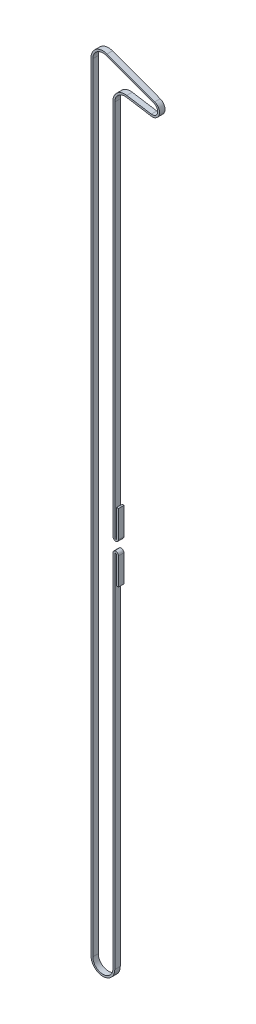
ISO-10303-21;
HEADER;
FILE_DESCRIPTION(('STEP AP214'),'2;1');
FILE_NAME('part.step','',(''),(''),'','','');
FILE_SCHEMA(('AUTOMOTIVE_DESIGN { 1 0 10303 214 1 1 1 1 }'));
ENDSEC;
DATA;
#1=APPLICATION_CONTEXT('core data for automotive mechanical design processes');
#2=APPLICATION_PROTOCOL_DEFINITION('international standard','automotive_design',2000,#1);
#3=PRODUCT_CONTEXT('',#1,'mechanical');
#4=PRODUCT('Part','Part','',(#3));
#5=PRODUCT_RELATED_PRODUCT_CATEGORY('part','',(#4));
#6=PRODUCT_DEFINITION_FORMATION('','',#4);
#7=PRODUCT_DEFINITION_CONTEXT('part definition',#1,'design');
#8=PRODUCT_DEFINITION('design','',#6,#7);
#9=PRODUCT_DEFINITION_SHAPE('','',#8);
#10=(LENGTH_UNIT() NAMED_UNIT(*) SI_UNIT(.MILLI.,.METRE.));
#11=(NAMED_UNIT(*) PLANE_ANGLE_UNIT() SI_UNIT($,.RADIAN.));
#12=(NAMED_UNIT(*) SI_UNIT($,.STERADIAN.) SOLID_ANGLE_UNIT());
#13=UNCERTAINTY_MEASURE_WITH_UNIT(LENGTH_MEASURE(1.E-05),#10,'distance_accuracy_value','');
#14=(GEOMETRIC_REPRESENTATION_CONTEXT(3) GLOBAL_UNCERTAINTY_ASSIGNED_CONTEXT((#13)) GLOBAL_UNIT_ASSIGNED_CONTEXT((#10,
#11,#12)) REPRESENTATION_CONTEXT('',''));
#15=CARTESIAN_POINT('',(0.,0.,0.));
#16=DIRECTION('',(0.,0.,1.));
#17=DIRECTION('',(1.,0.,0.));
#18=AXIS2_PLACEMENT_3D('',#15,#16,#17);
#19=CARTESIAN_POINT('',(12.9999999999839,-733.966690530104,6.));
#20=DIRECTION('',(0.,0.,-1.));
#21=DIRECTION('',(-1.,0.,0.));
#22=AXIS2_PLACEMENT_3D('',#19,#20,#21);
#23=CYLINDRICAL_SURFACE('',#22,12.9999999999839);
#24=CARTESIAN_POINT('',(12.9999999999839,-733.966690530104,0.));
#25=DIRECTION('',(0.,0.,1.));
#26=DIRECTION('',(1.,0.,0.));
#27=AXIS2_PLACEMENT_3D('',#24,#25,#26);
#28=CIRCLE('',#27,12.9999999999839);
#29=CARTESIAN_POINT('',(0.,-733.9666905301,0.));
#30=VERTEX_POINT('',#29);
#31=CARTESIAN_POINT('',(25.9999999999678,-733.966690530096,0.));
#32=VERTEX_POINT('',#31);
#33=EDGE_CURVE('E254',#30,#32,#28,.T.);
#34=ORIENTED_EDGE('',*,*,#33,.T.);
#35=DIRECTION('',(0.,0.,-1.));
#36=VECTOR('',#35,1.);
#37=CARTESIAN_POINT('',(25.9999999999678,-733.966690530096,6.));
#38=LINE('',#37,#36);
#39=CARTESIAN_POINT('',(25.9999999999678,-733.966690530096,6.));
#40=VERTEX_POINT('',#39);
#41=EDGE_CURVE('E41',#40,#32,#38,.T.);
#42=ORIENTED_EDGE('',*,*,#41,.F.);
#43=CARTESIAN_POINT('',(12.9999999999839,-733.966690530104,6.));
#44=DIRECTION('',(0.,0.,1.));
#45=DIRECTION('',(1.,0.,0.));
#46=AXIS2_PLACEMENT_3D('',#43,#44,#45);
#47=CIRCLE('',#46,12.9999999999839);
#48=CARTESIAN_POINT('',(0.,-733.9666905301,6.));
#49=VERTEX_POINT('',#48);
#50=EDGE_CURVE('E154',#49,#40,#47,.T.);
#51=ORIENTED_EDGE('',*,*,#50,.F.);
#52=DIRECTION('',(0.,0.,-1.));
#53=VECTOR('',#52,1.);
#54=CARTESIAN_POINT('',(0.,-733.9666905301,6.));
#55=LINE('',#54,#53);
#56=EDGE_CURVE('E11',#49,#30,#55,.T.);
#57=ORIENTED_EDGE('',*,*,#56,.T.);
#58=EDGE_LOOP('',(#34,#42,#51,#57));
#59=FACE_BOUND('',#58,.T.);
#60=ADVANCED_FACE('F33',(#59),#23,.T.);
#61=CARTESIAN_POINT('',(25.9999999999678,-340.488878188657,6.));
#62=DIRECTION('',(-1.,0.,0.));
#63=DIRECTION('',(0.,0.,1.));
#64=AXIS2_PLACEMENT_3D('',#61,#62,#63);
#65=PLANE('',#64);
#66=DIRECTION('',(0.,1.,0.));
#67=VECTOR('',#66,1.);
#68=CARTESIAN_POINT('',(25.9999999999678,-340.488878188657,0.));
#69=LINE('',#68,#67);
#70=CARTESIAN_POINT('',(25.9999999999678,-340.488878188657,0.));
#71=VERTEX_POINT('',#70);
#72=EDGE_CURVE('E256',#32,#71,#69,.T.);
#73=ORIENTED_EDGE('',*,*,#72,.T.);
#74=DIRECTION('',(0.,0.,-1.));
#75=VECTOR('',#74,1.);
#76=CARTESIAN_POINT('',(25.9999999999678,-340.488878188657,6.));
#77=LINE('',#76,#75);
#78=CARTESIAN_POINT('',(25.9999999999678,-340.488878188657,6.));
#79=VERTEX_POINT('',#78);
#80=EDGE_CURVE('E374',#79,#71,#77,.T.);
#81=ORIENTED_EDGE('',*,*,#80,.F.);
#82=DIRECTION('',(0.,1.,0.));
#83=VECTOR('',#82,1.);
#84=CARTESIAN_POINT('',(25.9999999999678,-340.488878188657,6.));
#85=LINE('',#84,#83);
#86=EDGE_CURVE('E382',#40,#79,#85,.T.);
#87=ORIENTED_EDGE('',*,*,#86,.F.);
#88=ORIENTED_EDGE('',*,*,#41,.T.);
#89=EDGE_LOOP('',(#73,#81,#87,#88));
#90=FACE_BOUND('',#89,.T.);
#91=ADVANCED_FACE('F380',(#90),#65,.F.);
#92=CARTESIAN_POINT('',(26.9999996990473,-340.488878188657,6.));
#93=DIRECTION('',(0.,0.,-1.));
#94=DIRECTION('',(-1.,0.,0.));
#95=AXIS2_PLACEMENT_3D('',#92,#93,#94);
#96=CYLINDRICAL_SURFACE('',#95,0.999999699079478);
#97=CARTESIAN_POINT('',(26.9999996990473,-340.488878188657,0.));
#98=DIRECTION('',(0.,0.,-1.));
#99=DIRECTION('',(-1.,0.,0.));
#100=AXIS2_PLACEMENT_3D('',#97,#98,#99);
#101=CIRCLE('',#100,0.999999699079478);
#102=CARTESIAN_POINT('',(27.9999993981268,-340.488878188657,0.));
#103=VERTEX_POINT('',#102);
#104=EDGE_CURVE('E258',#71,#103,#101,.T.);
#105=ORIENTED_EDGE('',*,*,#104,.T.);
#106=DIRECTION('',(0.,0.,-1.));
#107=VECTOR('',#106,1.);
#108=CARTESIAN_POINT('',(27.9999993981268,-340.488878188657,6.));
#109=LINE('',#108,#107);
#110=CARTESIAN_POINT('',(27.9999993981268,-340.488878188657,6.));
#111=VERTEX_POINT('',#110);
#112=EDGE_CURVE('E371',#111,#103,#109,.T.);
#113=ORIENTED_EDGE('',*,*,#112,.F.);
#114=CARTESIAN_POINT('',(26.9999996990473,-340.488878188657,6.));
#115=DIRECTION('',(0.,0.,-1.));
#116=DIRECTION('',(-1.,0.,0.));
#117=AXIS2_PLACEMENT_3D('',#114,#115,#116);
#118=CIRCLE('',#117,0.999999699079478);
#119=EDGE_CURVE('E398',#79,#111,#118,.T.);
#120=ORIENTED_EDGE('',*,*,#119,.F.);
#121=ORIENTED_EDGE('',*,*,#80,.T.);
#122=EDGE_LOOP('',(#105,#113,#120,#121));
#123=FACE_BOUND('',#122,.T.);
#124=ADVANCED_FACE('F389',(#123),#96,.F.);
#125=CARTESIAN_POINT('',(27.9999993981268,-340.488878188657,6.));
#126=DIRECTION('',(1.,0.,0.));
#127=DIRECTION('',(0.,0.,-1.));
#128=AXIS2_PLACEMENT_3D('',#125,#126,#127);
#129=PLANE('',#128);
#130=DIRECTION('',(0.,-1.,0.));
#131=VECTOR('',#130,1.);
#132=CARTESIAN_POINT('',(27.9999993981268,-340.488878188657,0.));
#133=LINE('',#132,#131);
#134=CARTESIAN_POINT('',(27.9999993981268,-370.001272476446,0.));
#135=VERTEX_POINT('',#134);
#136=EDGE_CURVE('E260',#103,#135,#133,.T.);
#137=ORIENTED_EDGE('',*,*,#136,.T.);
#138=DIRECTION('',(0.,0.,-1.));
#139=VECTOR('',#138,1.);
#140=CARTESIAN_POINT('',(27.9999993981268,-370.001272476446,6.));
#141=LINE('',#140,#139);
#142=CARTESIAN_POINT('',(27.9999993981268,-370.001272476446,6.));
#143=VERTEX_POINT('',#142);
#144=EDGE_CURVE('E368',#143,#135,#141,.T.);
#145=ORIENTED_EDGE('',*,*,#144,.F.);
#146=DIRECTION('',(0.,-1.,0.));
#147=VECTOR('',#146,1.);
#148=CARTESIAN_POINT('',(27.9999993981268,-340.488878188657,6.));
#149=LINE('',#148,#147);
#150=EDGE_CURVE('E395',#111,#143,#149,.T.);
#151=ORIENTED_EDGE('',*,*,#150,.F.);
#152=ORIENTED_EDGE('',*,*,#112,.T.);
#153=EDGE_LOOP('',(#137,#145,#151,#152));
#154=FACE_BOUND('',#153,.T.);
#155=ADVANCED_FACE('F393',(#154),#129,.F.);
#156=CARTESIAN_POINT('',(27.9999993981268,-370.001272476446,6.));
#157=DIRECTION('',(0.,1.,0.));
#158=DIRECTION('',(0.,0.,1.));
#159=AXIS2_PLACEMENT_3D('',#156,#157,#158);
#160=PLANE('',#159);
#161=DIRECTION('',(1.,0.,0.));
#162=VECTOR('',#161,1.);
#163=CARTESIAN_POINT('',(27.9999993981268,-370.001272476446,0.));
#164=LINE('',#163,#162);
#165=CARTESIAN_POINT('',(29.9999993998322,-370.001272476446,0.));
#166=VERTEX_POINT('',#165);
#167=EDGE_CURVE('E262',#135,#166,#164,.T.);
#168=ORIENTED_EDGE('',*,*,#167,.T.);
#169=DIRECTION('',(0.,0.,-1.));
#170=VECTOR('',#169,1.);
#171=CARTESIAN_POINT('',(29.9999993998322,-370.001272476446,6.));
#172=LINE('',#171,#170);
#173=CARTESIAN_POINT('',(29.9999993998322,-370.001272476446,6.));
#174=VERTEX_POINT('',#173);
#175=EDGE_CURVE('E365',#174,#166,#172,.T.);
#176=ORIENTED_EDGE('',*,*,#175,.F.);
#177=DIRECTION('',(1.,0.,0.));
#178=VECTOR('',#177,1.);
#179=CARTESIAN_POINT('',(27.9999993981268,-370.001272476446,6.));
#180=LINE('',#179,#178);
#181=EDGE_CURVE('E397',#143,#174,#180,.T.);
#182=ORIENTED_EDGE('',*,*,#181,.F.);
#183=ORIENTED_EDGE('',*,*,#144,.T.);
#184=EDGE_LOOP('',(#168,#176,#182,#183));
#185=FACE_BOUND('',#184,.T.);
#186=ADVANCED_FACE('F464',(#185),#160,.F.);
#187=CARTESIAN_POINT('',(29.9999993998322,-370.001272476446,6.));
#188=DIRECTION('',(-1.,0.,0.));
#189=DIRECTION('',(0.,0.,1.));
#190=AXIS2_PLACEMENT_3D('',#187,#188,#189);
#191=PLANE('',#190);
#192=DIRECTION('',(0.,1.,0.));
#193=VECTOR('',#192,1.);
#194=CARTESIAN_POINT('',(29.9999993998322,-370.001272476446,0.));
#195=LINE('',#194,#193);
#196=CARTESIAN_POINT('',(29.9999993998322,-340.488878188651,0.));
#197=VERTEX_POINT('',#196);
#198=EDGE_CURVE('E264',#166,#197,#195,.T.);
#199=ORIENTED_EDGE('',*,*,#198,.T.);
#200=DIRECTION('',(0.,0.,-1.));
#201=VECTOR('',#200,1.);
#202=CARTESIAN_POINT('',(29.9999993998322,-340.488878188651,6.));
#203=LINE('',#202,#201);
#204=CARTESIAN_POINT('',(29.9999993998322,-340.488878188651,6.));
#205=VERTEX_POINT('',#204);
#206=EDGE_CURVE('E362',#205,#197,#203,.T.);
#207=ORIENTED_EDGE('',*,*,#206,.F.);
#208=DIRECTION('',(0.,1.,0.));
#209=VECTOR('',#208,1.);
#210=CARTESIAN_POINT('',(29.9999993998322,-370.001272476446,6.));
#211=LINE('',#210,#209);
#212=EDGE_CURVE('E400',#174,#205,#211,.T.);
#213=ORIENTED_EDGE('',*,*,#212,.F.);
#214=ORIENTED_EDGE('',*,*,#175,.T.);
#215=EDGE_LOOP('',(#199,#207,#213,#214));
#216=FACE_BOUND('',#215,.T.);
#217=ADVANCED_FACE('F467',(#216),#191,.F.);
#218=CARTESIAN_POINT('',(26.9999996999,-340.488878188651,6.));
#219=DIRECTION('',(0.,0.,-1.));
#220=DIRECTION('',(-1.,0.,0.));
#221=AXIS2_PLACEMENT_3D('',#218,#219,#220);
#222=CYLINDRICAL_SURFACE('',#221,2.99999969993219);
#223=CARTESIAN_POINT('',(26.9999996999,-340.488878188651,0.));
#224=DIRECTION('',(0.,0.,1.));
#225=DIRECTION('',(-1.,0.,0.));
#226=AXIS2_PLACEMENT_3D('',#223,#224,#225);
#227=CIRCLE('',#226,2.99999969993219);
#228=CARTESIAN_POINT('',(23.9999999999678,-340.488878188651,0.));
#229=VERTEX_POINT('',#228);
#230=EDGE_CURVE('E266',#197,#229,#227,.T.);
#231=ORIENTED_EDGE('',*,*,#230,.T.);
#232=DIRECTION('',(0.,0.,-1.));
#233=VECTOR('',#232,1.);
#234=CARTESIAN_POINT('',(23.9999999999678,-340.488878188651,6.));
#235=LINE('',#234,#233);
#236=CARTESIAN_POINT('',(23.9999999999678,-340.488878188651,6.));
#237=VERTEX_POINT('',#236);
#238=EDGE_CURVE('E359',#237,#229,#235,.T.);
#239=ORIENTED_EDGE('',*,*,#238,.F.);
#240=CARTESIAN_POINT('',(26.9999996999,-340.488878188651,6.));
#241=DIRECTION('',(0.,0.,1.));
#242=DIRECTION('',(-1.,0.,0.));
#243=AXIS2_PLACEMENT_3D('',#240,#241,#242);
#244=CIRCLE('',#243,2.99999969993219);
#245=EDGE_CURVE('E406',#205,#237,#244,.T.);
#246=ORIENTED_EDGE('',*,*,#245,.F.);
#247=ORIENTED_EDGE('',*,*,#206,.T.);
#248=EDGE_LOOP('',(#231,#239,#246,#247));
#249=FACE_BOUND('',#248,.T.);
#250=ADVANCED_FACE('F471',(#249),#222,.T.);
#251=CARTESIAN_POINT('',(23.9999999999678,-340.488878188651,6.));
#252=DIRECTION('',(1.,0.,0.));
#253=DIRECTION('',(0.,0.,-1.));
#254=AXIS2_PLACEMENT_3D('',#251,#252,#253);
#255=PLANE('',#254);
#256=DIRECTION('',(0.,-1.,0.));
#257=VECTOR('',#256,1.);
#258=CARTESIAN_POINT('',(23.9999999999678,-340.488878188651,0.));
#259=LINE('',#258,#257);
#260=CARTESIAN_POINT('',(23.9999999999678,-733.966690530104,0.));
#261=VERTEX_POINT('',#260);
#262=EDGE_CURVE('E268',#229,#261,#259,.T.);
#263=ORIENTED_EDGE('',*,*,#262,.T.);
#264=DIRECTION('',(0.,0.,-1.));
#265=VECTOR('',#264,1.);
#266=CARTESIAN_POINT('',(23.9999999999678,-733.966690530104,6.));
#267=LINE('',#266,#265);
#268=CARTESIAN_POINT('',(23.9999999999678,-733.966690530104,6.));
#269=VERTEX_POINT('',#268);
#270=EDGE_CURVE('E356',#269,#261,#267,.T.);
#271=ORIENTED_EDGE('',*,*,#270,.F.);
#272=DIRECTION('',(0.,-1.,0.));
#273=VECTOR('',#272,1.);
#274=CARTESIAN_POINT('',(23.9999999999678,-340.488878188651,6.));
#275=LINE('',#274,#273);
#276=EDGE_CURVE('E408',#237,#269,#275,.T.);
#277=ORIENTED_EDGE('',*,*,#276,.F.);
#278=ORIENTED_EDGE('',*,*,#238,.T.);
#279=EDGE_LOOP('',(#263,#271,#277,#278));
#280=FACE_BOUND('',#279,.T.);
#281=ADVANCED_FACE('F475',(#280),#255,.F.);
#282=CARTESIAN_POINT('',(12.9999999999839,-733.966690530104,6.));
#283=DIRECTION('',(0.,0.,-1.));
#284=DIRECTION('',(-1.,0.,0.));
#285=AXIS2_PLACEMENT_3D('',#282,#283,#284);
#286=CYLINDRICAL_SURFACE('',#285,10.9999999999839);
#287=CARTESIAN_POINT('',(12.9999999999839,-733.966690530104,0.));
#288=DIRECTION('',(0.,0.,-1.));
#289=DIRECTION('',(1.,0.,0.));
#290=AXIS2_PLACEMENT_3D('',#287,#288,#289);
#291=CIRCLE('',#290,10.9999999999839);
#292=CARTESIAN_POINT('',(2.,-733.966690530108,0.));
#293=VERTEX_POINT('',#292);
#294=EDGE_CURVE('E270',#261,#293,#291,.T.);
#295=ORIENTED_EDGE('',*,*,#294,.T.);
#296=DIRECTION('',(0.,0.,-1.));
#297=VECTOR('',#296,1.);
#298=CARTESIAN_POINT('',(2.,-733.966690530108,6.));
#299=LINE('',#298,#297);
#300=CARTESIAN_POINT('',(2.,-733.966690530108,6.));
#301=VERTEX_POINT('',#300);
#302=EDGE_CURVE('E353',#301,#293,#299,.T.);
#303=ORIENTED_EDGE('',*,*,#302,.F.);
#304=CARTESIAN_POINT('',(12.9999999999839,-733.966690530104,6.));
#305=DIRECTION('',(0.,0.,-1.));
#306=DIRECTION('',(1.,0.,0.));
#307=AXIS2_PLACEMENT_3D('',#304,#305,#306);
#308=CIRCLE('',#307,10.9999999999839);
#309=EDGE_CURVE('E410',#269,#301,#308,.T.);
#310=ORIENTED_EDGE('',*,*,#309,.F.);
#311=ORIENTED_EDGE('',*,*,#270,.T.);
#312=EDGE_LOOP('',(#295,#303,#310,#311));
#313=FACE_BOUND('',#312,.T.);
#314=ADVANCED_FACE('F479',(#313),#286,.F.);
#315=CARTESIAN_POINT('',(2.,100.,6.));
#316=DIRECTION('',(-1.,0.,0.));
#317=DIRECTION('',(0.,0.,1.));
#318=AXIS2_PLACEMENT_3D('',#315,#316,#317);
#319=PLANE('',#318);
#320=DIRECTION('',(0.,1.,0.));
#321=VECTOR('',#320,1.);
#322=CARTESIAN_POINT('',(2.,100.,0.));
#323=LINE('',#322,#321);
#324=CARTESIAN_POINT('',(2.,116.09935662604,0.));
#325=VERTEX_POINT('',#324);
#326=EDGE_CURVE('E273',#293,#325,#323,.T.);
#327=ORIENTED_EDGE('',*,*,#326,.T.);
#328=DIRECTION('',(0.,0.,-1.));
#329=VECTOR('',#328,1.);
#330=CARTESIAN_POINT('',(2.,116.09935662604,6.));
#331=LINE('',#330,#329);
#332=CARTESIAN_POINT('',(2.,116.09935662604,6.));
#333=VERTEX_POINT('',#332);
#334=EDGE_CURVE('E350',#333,#325,#331,.T.);
#335=ORIENTED_EDGE('',*,*,#334,.F.);
#336=DIRECTION('',(0.,1.,0.));
#337=VECTOR('',#336,1.);
#338=CARTESIAN_POINT('',(2.00000000000001,0.,6.));
#339=LINE('',#338,#337);
#340=EDGE_CURVE('E412',#301,#333,#339,.T.);
#341=ORIENTED_EDGE('',*,*,#340,.F.);
#342=ORIENTED_EDGE('',*,*,#302,.T.);
#343=EDGE_LOOP('',(#327,#335,#341,#342));
#344=FACE_BOUND('',#343,.T.);
#345=ADVANCED_FACE('F483',(#344),#319,.F.);
#346=CARTESIAN_POINT('',(12.9999999987214,116.09935662604,6.));
#347=DIRECTION('',(0.,0.,-1.));
#348=DIRECTION('',(-1.,0.,0.));
#349=AXIS2_PLACEMENT_3D('',#346,#347,#348);
#350=CYLINDRICAL_SURFACE('',#349,10.9999999987214);
#351=CARTESIAN_POINT('',(12.9999999987214,116.09935662604,0.));
#352=DIRECTION('',(0.,0.,-1.));
#353=DIRECTION('',(-1.,0.,0.));
#354=AXIS2_PLACEMENT_3D('',#351,#352,#353);
#355=CIRCLE('',#354,10.9999999987214);
#356=CARTESIAN_POINT('',(16.8065275909449,126.419741679976,0.));
#357=VERTEX_POINT('',#356);
#358=EDGE_CURVE('E275',#325,#357,#355,.T.);
#359=ORIENTED_EDGE('',*,*,#358,.T.);
#360=DIRECTION('',(0.,0.,-1.));
#361=VECTOR('',#360,1.);
#362=CARTESIAN_POINT('',(16.8065275909449,126.419741679976,6.));
#363=LINE('',#362,#361);
#364=CARTESIAN_POINT('',(16.8065275909449,126.419741679976,6.));
#365=VERTEX_POINT('',#364);
#366=EDGE_CURVE('E347',#365,#357,#363,.T.);
#367=ORIENTED_EDGE('',*,*,#366,.F.);
#368=CARTESIAN_POINT('',(12.9999999987214,116.09935662604,6.));
#369=DIRECTION('',(0.,0.,-1.));
#370=DIRECTION('',(-1.,0.,0.));
#371=AXIS2_PLACEMENT_3D('',#368,#369,#370);
#372=CIRCLE('',#371,10.9999999987214);
#373=EDGE_CURVE('E414',#333,#365,#372,.T.);
#374=ORIENTED_EDGE('',*,*,#373,.F.);
#375=ORIENTED_EDGE('',*,*,#334,.T.);
#376=EDGE_LOOP('',(#359,#367,#374,#375));
#377=FACE_BOUND('',#376,.T.);
#378=ADVANCED_FACE('F487',(#377),#350,.F.);
#379=CARTESIAN_POINT('',(16.8065275909449,126.419741679976,6.));
#380=DIRECTION('',(0.346047962969642,0.93821682319417,0.));
#381=DIRECTION('',(-0.938216823194171,0.346047962969642,0.));
#382=AXIS2_PLACEMENT_3D('',#379,#380,#381);
#383=PLANE('',#382);
#384=DIRECTION('',(0.938216823194171,-0.346047962969642,0.));
#385=VECTOR('',#384,1.);
#386=CARTESIAN_POINT('',(16.8065275909449,126.419741679976,0.));
#387=LINE('',#386,#385);
#388=CARTESIAN_POINT('',(68.9760381276381,107.177757946532,0.));
#389=VERTEX_POINT('',#388);
#390=EDGE_CURVE('E277',#357,#389,#387,.T.);
#391=ORIENTED_EDGE('',*,*,#390,.T.);
#392=DIRECTION('',(0.,0.,-1.));
#393=VECTOR('',#392,1.);
#394=CARTESIAN_POINT('',(68.9760381276381,107.177757946532,6.));
#395=LINE('',#394,#393);
#396=CARTESIAN_POINT('',(68.9760381276381,107.177757946532,6.));
#397=VERTEX_POINT('',#396);
#398=EDGE_CURVE('E344',#397,#389,#395,.T.);
#399=ORIENTED_EDGE('',*,*,#398,.F.);
#400=DIRECTION('',(0.938216823194171,-0.346047962969642,0.));
#401=VECTOR('',#400,1.);
#402=CARTESIAN_POINT('',(16.8065275909449,126.419741679976,6.));
#403=LINE('',#402,#401);
#404=EDGE_CURVE('E416',#365,#397,#403,.T.);
#405=ORIENTED_EDGE('',*,*,#404,.F.);
#406=ORIENTED_EDGE('',*,*,#366,.T.);
#407=EDGE_LOOP('',(#391,#399,#405,#406));
#408=FACE_BOUND('',#407,.T.);
#409=ADVANCED_FACE('F491',(#408),#383,.F.);
#410=CARTESIAN_POINT('',(66.8997503500902,101.548457008099,6.));
#411=DIRECTION('',(0.,0.,-1.));
#412=DIRECTION('',(-1.,0.,0.));
#413=AXIS2_PLACEMENT_3D('',#410,#411,#412);
#414=CYLINDRICAL_SURFACE('',#413,5.99999999921986);
#415=CARTESIAN_POINT('',(66.8997503500902,101.548457008099,0.));
#416=DIRECTION('',(0.,0.,-1.));
#417=DIRECTION('',(1.,0.,0.));
#418=AXIS2_PLACEMENT_3D('',#415,#416,#417);
#419=CIRCLE('',#418,5.99999999921986);
#420=CARTESIAN_POINT('',(65.949959716134,95.6241091332445,0.));
#421=VERTEX_POINT('',#420);
#422=EDGE_CURVE('E279',#389,#421,#419,.T.);
#423=ORIENTED_EDGE('',*,*,#422,.T.);
#424=DIRECTION('',(0.,0.,-1.));
#425=VECTOR('',#424,1.);
#426=CARTESIAN_POINT('',(65.949959716134,95.6241091332445,6.));
#427=LINE('',#426,#425);
#428=CARTESIAN_POINT('',(65.949959716134,95.6241091332445,6.));
#429=VERTEX_POINT('',#428);
#430=EDGE_CURVE('E341',#429,#421,#427,.T.);
#431=ORIENTED_EDGE('',*,*,#430,.F.);
#432=CARTESIAN_POINT('',(66.8997503500902,101.548457008099,6.));
#433=DIRECTION('',(0.,0.,-1.));
#434=DIRECTION('',(1.,0.,0.));
#435=AXIS2_PLACEMENT_3D('',#432,#433,#434);
#436=CIRCLE('',#435,5.99999999921986);
#437=EDGE_CURVE('E418',#397,#429,#436,.T.);
#438=ORIENTED_EDGE('',*,*,#437,.F.);
#439=ORIENTED_EDGE('',*,*,#398,.T.);
#440=EDGE_LOOP('',(#423,#431,#438,#439));
#441=FACE_BOUND('',#440,.T.);
#442=ADVANCED_FACE('F495',(#441),#414,.F.);
#443=CARTESIAN_POINT('',(65.949959716134,95.6241091332445,6.));
#444=DIRECTION('',(-0.158298439013279,-0.987391312604055,0.));
#445=DIRECTION('',(0.987391312604055,-0.158298439013279,0.));
#446=AXIS2_PLACEMENT_3D('',#443,#444,#445);
#447=PLANE('',#446);
#448=DIRECTION('',(-0.987391312604055,0.158298439013279,0.));
#449=VECTOR('',#448,1.);
#450=CARTESIAN_POINT('',(65.949959716134,95.6241091332445,0.));
#451=LINE('',#450,#449);
#452=CARTESIAN_POINT('',(39.0578797069214,99.9354436902112,0.));
#453=VERTEX_POINT('',#452);
#454=EDGE_CURVE('E281',#421,#453,#451,.T.);
#455=ORIENTED_EDGE('',*,*,#454,.T.);
#456=DIRECTION('',(0.,0.,-1.));
#457=VECTOR('',#456,1.);
#458=CARTESIAN_POINT('',(39.0578797069214,99.9354436902112,6.));
#459=LINE('',#458,#457);
#460=CARTESIAN_POINT('',(39.0578797069214,99.9354436902112,6.));
#461=VERTEX_POINT('',#460);
#462=EDGE_CURVE('E338',#461,#453,#459,.T.);
#463=ORIENTED_EDGE('',*,*,#462,.F.);
#464=DIRECTION('',(-0.987391312604055,0.158298439013279,0.));
#465=VECTOR('',#464,1.);
#466=CARTESIAN_POINT('',(65.949959716134,95.6241091332445,6.));
#467=LINE('',#466,#465);
#468=EDGE_CURVE('E420',#429,#461,#467,.T.);
#469=ORIENTED_EDGE('',*,*,#468,.F.);
#470=ORIENTED_EDGE('',*,*,#430,.T.);
#471=EDGE_LOOP('',(#455,#463,#469,#470));
#472=FACE_BOUND('',#471,.T.);
#473=ADVANCED_FACE('F499',(#472),#447,.F.);
#474=CARTESIAN_POINT('',(36.9999999996977,87.0993566260402,6.));
#475=DIRECTION('',(0.,0.,-1.));
#476=DIRECTION('',(-1.,0.,0.));
#477=AXIS2_PLACEMENT_3D('',#474,#475,#476);
#478=CYLINDRICAL_SURFACE('',#477,13.0000000003224);
#479=CARTESIAN_POINT('',(36.9999999996977,87.0993566260402,0.));
#480=DIRECTION('',(0.,0.,1.));
#481=DIRECTION('',(1.,0.,0.));
#482=AXIS2_PLACEMENT_3D('',#479,#480,#481);
#483=CIRCLE('',#482,13.0000000003224);
#484=CARTESIAN_POINT('',(23.9999999993753,87.0993566260402,0.));
#485=VERTEX_POINT('',#484);
#486=EDGE_CURVE('E283',#453,#485,#483,.T.);
#487=ORIENTED_EDGE('',*,*,#486,.T.);
#488=DIRECTION('',(0.,0.,-1.));
#489=VECTOR('',#488,1.);
#490=CARTESIAN_POINT('',(23.9999999993753,87.0993566260402,6.));
#491=LINE('',#490,#489);
#492=CARTESIAN_POINT('',(23.9999999993753,87.0993566260402,6.));
#493=VERTEX_POINT('',#492);
#494=EDGE_CURVE('E335',#493,#485,#491,.T.);
#495=ORIENTED_EDGE('',*,*,#494,.F.);
#496=CARTESIAN_POINT('',(36.9999999996977,87.0993566260402,6.));
#497=DIRECTION('',(0.,0.,1.));
#498=DIRECTION('',(1.,0.,0.));
#499=AXIS2_PLACEMENT_3D('',#496,#497,#498);
#500=CIRCLE('',#499,13.0000000003224);
#501=EDGE_CURVE('E422',#461,#493,#500,.T.);
#502=ORIENTED_EDGE('',*,*,#501,.F.);
#503=ORIENTED_EDGE('',*,*,#462,.T.);
#504=EDGE_LOOP('',(#487,#495,#502,#503));
#505=FACE_BOUND('',#504,.T.);
#506=ADVANCED_FACE('F503',(#505),#478,.T.);
#507=CARTESIAN_POINT('',(23.9999999993753,87.0993566260402,6.));
#508=DIRECTION('',(1.,0.,0.));
#509=DIRECTION('',(0.,0.,-1.));
#510=AXIS2_PLACEMENT_3D('',#507,#508,#509);
#511=PLANE('',#510);
#512=DIRECTION('',(0.,-1.,0.));
#513=VECTOR('',#512,1.);
#514=CARTESIAN_POINT('',(23.9999999993753,87.0993566260402,0.));
#515=LINE('',#514,#513);
#516=CARTESIAN_POINT('',(23.9999999993753,-325.141057670263,0.));
#517=VERTEX_POINT('',#516);
#518=EDGE_CURVE('E285',#485,#517,#515,.T.);
#519=ORIENTED_EDGE('',*,*,#518,.T.);
#520=DIRECTION('',(0.,0.,-1.));
#521=VECTOR('',#520,1.);
#522=CARTESIAN_POINT('',(23.9999999993753,-325.141057670263,6.));
#523=LINE('',#522,#521);
#524=CARTESIAN_POINT('',(23.9999999993753,-325.141057670263,6.));
#525=VERTEX_POINT('',#524);
#526=EDGE_CURVE('E332',#525,#517,#523,.T.);
#527=ORIENTED_EDGE('',*,*,#526,.F.);
#528=DIRECTION('',(0.,-1.,0.));
#529=VECTOR('',#528,1.);
#530=CARTESIAN_POINT('',(23.9999999993753,87.0993566260402,6.));
#531=LINE('',#530,#529);
#532=EDGE_CURVE('E424',#493,#525,#531,.T.);
#533=ORIENTED_EDGE('',*,*,#532,.F.);
#534=ORIENTED_EDGE('',*,*,#494,.T.);
#535=EDGE_LOOP('',(#519,#527,#533,#534));
#536=FACE_BOUND('',#535,.T.);
#537=ADVANCED_FACE('F507',(#536),#511,.F.);
#538=CARTESIAN_POINT('',(26.9999996993075,-325.141057670263,6.));
#539=DIRECTION('',(0.,0.,-1.));
#540=DIRECTION('',(-1.,0.,0.));
#541=AXIS2_PLACEMENT_3D('',#538,#539,#540);
#542=CYLINDRICAL_SURFACE('',#541,2.99999969993219);
#543=CARTESIAN_POINT('',(26.9999996993075,-325.141057670263,0.));
#544=DIRECTION('',(0.,0.,1.));
#545=DIRECTION('',(1.,0.,0.));
#546=AXIS2_PLACEMENT_3D('',#543,#544,#545);
#547=CIRCLE('',#546,2.99999969993219);
#548=CARTESIAN_POINT('',(29.9999993992397,-325.141057670263,0.));
#549=VERTEX_POINT('',#548);
#550=EDGE_CURVE('E287',#517,#549,#547,.T.);
#551=ORIENTED_EDGE('',*,*,#550,.T.);
#552=DIRECTION('',(0.,0.,-1.));
#553=VECTOR('',#552,1.);
#554=CARTESIAN_POINT('',(29.9999993992397,-325.141057670263,6.));
#555=LINE('',#554,#553);
#556=CARTESIAN_POINT('',(29.9999993992397,-325.141057670263,6.));
#557=VERTEX_POINT('',#556);
#558=EDGE_CURVE('E329',#557,#549,#555,.T.);
#559=ORIENTED_EDGE('',*,*,#558,.F.);
#560=CARTESIAN_POINT('',(26.9999996993075,-325.141057670263,6.));
#561=DIRECTION('',(0.,0.,1.));
#562=DIRECTION('',(1.,0.,0.));
#563=AXIS2_PLACEMENT_3D('',#560,#561,#562);
#564=CIRCLE('',#563,2.99999969993219);
#565=EDGE_CURVE('E426',#525,#557,#564,.T.);
#566=ORIENTED_EDGE('',*,*,#565,.F.);
#567=ORIENTED_EDGE('',*,*,#526,.T.);
#568=EDGE_LOOP('',(#551,#559,#566,#567));
#569=FACE_BOUND('',#568,.T.);
#570=ADVANCED_FACE('F511',(#569),#542,.T.);
#571=CARTESIAN_POINT('',(29.9999993992397,-295.628663382494,6.));
#572=DIRECTION('',(-1.,0.,0.));
#573=DIRECTION('',(0.,0.,1.));
#574=AXIS2_PLACEMENT_3D('',#571,#572,#573);
#575=PLANE('',#574);
#576=DIRECTION('',(0.,1.,0.));
#577=VECTOR('',#576,1.);
#578=CARTESIAN_POINT('',(29.9999993992397,-295.628663382494,0.));
#579=LINE('',#578,#577);
#580=CARTESIAN_POINT('',(29.9999993992397,-295.628663382494,0.));
#581=VERTEX_POINT('',#580);
#582=EDGE_CURVE('E289',#549,#581,#579,.T.);
#583=ORIENTED_EDGE('',*,*,#582,.T.);
#584=DIRECTION('',(0.,0.,-1.));
#585=VECTOR('',#584,1.);
#586=CARTESIAN_POINT('',(29.9999993992397,-295.628663382494,6.));
#587=LINE('',#586,#585);
#588=CARTESIAN_POINT('',(29.9999993992397,-295.628663382494,6.));
#589=VERTEX_POINT('',#588);
#590=EDGE_CURVE('E326',#589,#581,#587,.T.);
#591=ORIENTED_EDGE('',*,*,#590,.F.);
#592=DIRECTION('',(0.,1.,0.));
#593=VECTOR('',#592,1.);
#594=CARTESIAN_POINT('',(29.9999993992397,-295.628663382494,6.));
#595=LINE('',#594,#593);
#596=EDGE_CURVE('E428',#557,#589,#595,.T.);
#597=ORIENTED_EDGE('',*,*,#596,.F.);
#598=ORIENTED_EDGE('',*,*,#558,.T.);
#599=EDGE_LOOP('',(#583,#591,#597,#598));
#600=FACE_BOUND('',#599,.T.);
#601=ADVANCED_FACE('F515',(#600),#575,.F.);
#602=CARTESIAN_POINT('',(27.9999993971631,-295.628663382494,6.));
#603=DIRECTION('',(0.,-1.,0.));
#604=DIRECTION('',(0.,0.,-1.));
#605=AXIS2_PLACEMENT_3D('',#602,#603,#604);
#606=PLANE('',#605);
#607=DIRECTION('',(-1.,0.,0.));
#608=VECTOR('',#607,1.);
#609=CARTESIAN_POINT('',(27.9999993971631,-295.628663382494,0.));
#610=LINE('',#609,#608);
#611=CARTESIAN_POINT('',(27.9999993971631,-295.628663382494,0.));
#612=VERTEX_POINT('',#611);
#613=EDGE_CURVE('E291',#581,#612,#610,.T.);
#614=ORIENTED_EDGE('',*,*,#613,.T.);
#615=DIRECTION('',(0.,0.,-1.));
#616=VECTOR('',#615,1.);
#617=CARTESIAN_POINT('',(27.9999993971631,-295.628663382494,6.));
#618=LINE('',#617,#616);
#619=CARTESIAN_POINT('',(27.9999993971631,-295.628663382494,6.));
#620=VERTEX_POINT('',#619);
#621=EDGE_CURVE('E323',#620,#612,#618,.T.);
#622=ORIENTED_EDGE('',*,*,#621,.F.);
#623=DIRECTION('',(-1.,0.,0.));
#624=VECTOR('',#623,1.);
#625=CARTESIAN_POINT('',(27.9999993971631,-295.628663382494,6.));
#626=LINE('',#625,#624);
#627=EDGE_CURVE('E430',#589,#620,#626,.T.);
#628=ORIENTED_EDGE('',*,*,#627,.F.);
#629=ORIENTED_EDGE('',*,*,#590,.T.);
#630=EDGE_LOOP('',(#614,#622,#628,#629));
#631=FACE_BOUND('',#630,.T.);
#632=ADVANCED_FACE('F519',(#631),#606,.F.);
#633=CARTESIAN_POINT('',(27.9999993971631,-325.141057670266,6.));
#634=DIRECTION('',(1.,0.,0.));
#635=DIRECTION('',(0.,0.,-1.));
#636=AXIS2_PLACEMENT_3D('',#633,#634,#635);
#637=PLANE('',#636);
#638=DIRECTION('',(0.,-1.,0.));
#639=VECTOR('',#638,1.);
#640=CARTESIAN_POINT('',(27.9999993971631,-325.141057670266,0.));
#641=LINE('',#640,#639);
#642=CARTESIAN_POINT('',(27.9999993971631,-325.141057670268,0.));
#643=VERTEX_POINT('',#642);
#644=EDGE_CURVE('E293',#612,#643,#641,.T.);
#645=ORIENTED_EDGE('',*,*,#644,.T.);
#646=DIRECTION('',(0.,0.,-1.));
#647=VECTOR('',#646,1.);
#648=CARTESIAN_POINT('',(27.9999993971631,-325.141057670268,6.));
#649=LINE('',#648,#647);
#650=CARTESIAN_POINT('',(27.9999993971631,-325.141057670268,6.));
#651=VERTEX_POINT('',#650);
#652=EDGE_CURVE('E320',#651,#643,#649,.T.);
#653=ORIENTED_EDGE('',*,*,#652,.F.);
#654=DIRECTION('',(0.,-1.,0.));
#655=VECTOR('',#654,1.);
#656=CARTESIAN_POINT('',(27.9999993971631,-325.141057670266,6.));
#657=LINE('',#656,#655);
#658=EDGE_CURVE('E432',#620,#651,#657,.T.);
#659=ORIENTED_EDGE('',*,*,#658,.F.);
#660=ORIENTED_EDGE('',*,*,#621,.T.);
#661=EDGE_LOOP('',(#645,#653,#659,#660));
#662=FACE_BOUND('',#661,.T.);
#663=ADVANCED_FACE('F523',(#662),#637,.F.);
#664=CARTESIAN_POINT('',(26.9999996982692,-325.141057670268,6.));
#665=DIRECTION('',(0.,0.,-1.));
#666=DIRECTION('',(-1.,0.,0.));
#667=AXIS2_PLACEMENT_3D('',#664,#665,#666);
#668=CYLINDRICAL_SURFACE('',#667,0.999999698893896);
#669=CARTESIAN_POINT('',(26.9999996982692,-325.141057670268,0.));
#670=DIRECTION('',(0.,0.,-1.));
#671=DIRECTION('',(1.,0.,0.));
#672=AXIS2_PLACEMENT_3D('',#669,#670,#671);
#673=CIRCLE('',#672,0.999999698893896);
#674=CARTESIAN_POINT('',(25.9999999993753,-325.141057670265,0.));
#675=VERTEX_POINT('',#674);
#676=EDGE_CURVE('E295',#643,#675,#673,.T.);
#677=ORIENTED_EDGE('',*,*,#676,.T.);
#678=DIRECTION('',(0.,0.,-1.));
#679=VECTOR('',#678,1.);
#680=CARTESIAN_POINT('',(25.9999999993753,-325.141057670265,6.));
#681=LINE('',#680,#679);
#682=CARTESIAN_POINT('',(25.9999999993753,-325.141057670265,6.));
#683=VERTEX_POINT('',#682);
#684=EDGE_CURVE('E317',#683,#675,#681,.T.);
#685=ORIENTED_EDGE('',*,*,#684,.F.);
#686=CARTESIAN_POINT('',(26.9999996982692,-325.141057670268,6.));
#687=DIRECTION('',(0.,0.,-1.));
#688=DIRECTION('',(1.,0.,0.));
#689=AXIS2_PLACEMENT_3D('',#686,#687,#688);
#690=CIRCLE('',#689,0.999999698893896);
#691=EDGE_CURVE('E434',#651,#683,#690,.T.);
#692=ORIENTED_EDGE('',*,*,#691,.F.);
#693=ORIENTED_EDGE('',*,*,#652,.T.);
#694=EDGE_LOOP('',(#677,#685,#692,#693));
#695=FACE_BOUND('',#694,.T.);
#696=ADVANCED_FACE('F527',(#695),#668,.F.);
#697=CARTESIAN_POINT('',(25.9999999993753,87.0993566260402,6.));
#698=DIRECTION('',(-1.,0.,0.));
#699=DIRECTION('',(0.,-1.,0.));
#700=AXIS2_PLACEMENT_3D('',#697,#698,#699);
#701=PLANE('',#700);
#702=DIRECTION('',(0.,1.,0.));
#703=VECTOR('',#702,1.);
#704=CARTESIAN_POINT('',(25.9999999993753,87.0993566260402,0.));
#705=LINE('',#704,#703);
#706=CARTESIAN_POINT('',(25.9999999993753,87.0993566260402,0.));
#707=VERTEX_POINT('',#706);
#708=EDGE_CURVE('E297',#675,#707,#705,.T.);
#709=ORIENTED_EDGE('',*,*,#708,.T.);
#710=DIRECTION('',(0.,0.,-1.));
#711=VECTOR('',#710,1.);
#712=CARTESIAN_POINT('',(25.9999999993753,87.0993566260402,6.));
#713=LINE('',#712,#711);
#714=CARTESIAN_POINT('',(25.9999999993753,87.0993566260402,6.));
#715=VERTEX_POINT('',#714);
#716=EDGE_CURVE('E314',#715,#707,#713,.T.);
#717=ORIENTED_EDGE('',*,*,#716,.F.);
#718=DIRECTION('',(0.,1.,0.));
#719=VECTOR('',#718,1.);
#720=CARTESIAN_POINT('',(25.9999999993753,87.0993566260402,6.));
#721=LINE('',#720,#719);
#722=EDGE_CURVE('E436',#683,#715,#721,.T.);
#723=ORIENTED_EDGE('',*,*,#722,.F.);
#724=ORIENTED_EDGE('',*,*,#684,.T.);
#725=EDGE_LOOP('',(#709,#717,#723,#724));
#726=FACE_BOUND('',#725,.T.);
#727=ADVANCED_FACE('F531',(#726),#701,.F.);
#728=CARTESIAN_POINT('',(36.9999999996977,87.0993566260402,6.));
#729=DIRECTION('',(0.,0.,-1.));
#730=DIRECTION('',(-1.,0.,0.));
#731=AXIS2_PLACEMENT_3D('',#728,#729,#730);
#732=CYLINDRICAL_SURFACE('',#731,11.0000000003224);
#733=CARTESIAN_POINT('',(36.9999999996977,87.0993566260402,0.));
#734=DIRECTION('',(0.,0.,-1.));
#735=DIRECTION('',(1.,0.,0.));
#736=AXIS2_PLACEMENT_3D('',#733,#734,#735);
#737=CIRCLE('',#736,11.0000000003224);
#738=CARTESIAN_POINT('',(38.7412828288948,97.9606610650031,0.));
#739=VERTEX_POINT('',#738);
#740=EDGE_CURVE('E299',#707,#739,#737,.T.);
#741=ORIENTED_EDGE('',*,*,#740,.T.);
#742=DIRECTION('',(0.,0.,-1.));
#743=VECTOR('',#742,1.);
#744=CARTESIAN_POINT('',(38.7412828288948,97.9606610650031,6.));
#745=LINE('',#744,#743);
#746=CARTESIAN_POINT('',(38.7412828288948,97.9606610650031,6.));
#747=VERTEX_POINT('',#746);
#748=EDGE_CURVE('E311',#747,#739,#745,.T.);
#749=ORIENTED_EDGE('',*,*,#748,.F.);
#750=CARTESIAN_POINT('',(36.9999999996977,87.0993566260402,6.));
#751=DIRECTION('',(0.,0.,-1.));
#752=DIRECTION('',(1.,0.,0.));
#753=AXIS2_PLACEMENT_3D('',#750,#751,#752);
#754=CIRCLE('',#753,11.0000000003224);
#755=EDGE_CURVE('E438',#715,#747,#754,.T.);
#756=ORIENTED_EDGE('',*,*,#755,.F.);
#757=ORIENTED_EDGE('',*,*,#716,.T.);
#758=EDGE_LOOP('',(#741,#749,#756,#757));
#759=FACE_BOUND('',#758,.T.);
#760=ADVANCED_FACE('F444',(#759),#732,.F.);
#761=CARTESIAN_POINT('',(65.6333628381075,93.6493265080364,6.));
#762=DIRECTION('',(0.158298439013279,0.987391312604055,0.));
#763=DIRECTION('',(-0.987391312604055,0.158298439013279,0.));
#764=AXIS2_PLACEMENT_3D('',#761,#762,#763);
#765=PLANE('',#764);
#766=DIRECTION('',(0.987391312604055,-0.158298439013279,0.));
#767=VECTOR('',#766,1.);
#768=CARTESIAN_POINT('',(65.6333628381075,93.6493265080364,0.));
#769=LINE('',#768,#767);
#770=CARTESIAN_POINT('',(65.6333628381075,93.6493265080364,0.));
#771=VERTEX_POINT('',#770);
#772=EDGE_CURVE('E301',#739,#771,#769,.T.);
#773=ORIENTED_EDGE('',*,*,#772,.T.);
#774=DIRECTION('',(0.,0.,-1.));
#775=VECTOR('',#774,1.);
#776=CARTESIAN_POINT('',(65.6333628381075,93.6493265080364,6.));
#777=LINE('',#776,#775);
#778=CARTESIAN_POINT('',(65.6333628381075,93.6493265080364,6.));
#779=VERTEX_POINT('',#778);
#780=EDGE_CURVE('E243',#779,#771,#777,.T.);
#781=ORIENTED_EDGE('',*,*,#780,.F.);
#782=DIRECTION('',(0.987391312604055,-0.158298439013279,0.));
#783=VECTOR('',#782,1.);
#784=CARTESIAN_POINT('',(65.6333628381075,93.6493265080364,6.));
#785=LINE('',#784,#783);
#786=EDGE_CURVE('E234',#747,#779,#785,.T.);
#787=ORIENTED_EDGE('',*,*,#786,.F.);
#788=ORIENTED_EDGE('',*,*,#748,.T.);
#789=EDGE_LOOP('',(#773,#781,#787,#788));
#790=FACE_BOUND('',#789,.T.);
#791=ADVANCED_FACE('F448',(#790),#765,.F.);
#792=CARTESIAN_POINT('',(66.8997503500902,101.548457008099,6.));
#793=DIRECTION('',(0.,0.,-1.));
#794=DIRECTION('',(-1.,0.,0.));
#795=AXIS2_PLACEMENT_3D('',#792,#793,#794);
#796=CYLINDRICAL_SURFACE('',#795,7.99999999921988);
#797=CARTESIAN_POINT('',(66.8997503500902,101.548457008099,0.));
#798=DIRECTION('',(0.,0.,1.));
#799=DIRECTION('',(1.,0.,0.));
#800=AXIS2_PLACEMENT_3D('',#797,#798,#799);
#801=CIRCLE('',#800,7.99999999921988);
#802=CARTESIAN_POINT('',(69.6681340535774,109.05419159292,0.));
#803=VERTEX_POINT('',#802);
#804=EDGE_CURVE('E242',#771,#803,#801,.T.);
#805=ORIENTED_EDGE('',*,*,#804,.T.);
#806=DIRECTION('',(0.,0.,-1.));
#807=VECTOR('',#806,1.);
#808=CARTESIAN_POINT('',(69.6681340535774,109.05419159292,6.));
#809=LINE('',#808,#807);
#810=CARTESIAN_POINT('',(69.6681340535774,109.05419159292,6.));
#811=VERTEX_POINT('',#810);
#812=EDGE_CURVE('E239',#811,#803,#809,.T.);
#813=ORIENTED_EDGE('',*,*,#812,.F.);
#814=CARTESIAN_POINT('',(66.8997503500902,101.548457008099,6.));
#815=DIRECTION('',(0.,0.,1.));
#816=DIRECTION('',(1.,0.,0.));
#817=AXIS2_PLACEMENT_3D('',#814,#815,#816);
#818=CIRCLE('',#817,7.99999999921988);
#819=EDGE_CURVE('E228',#779,#811,#818,.T.);
#820=ORIENTED_EDGE('',*,*,#819,.F.);
#821=ORIENTED_EDGE('',*,*,#780,.T.);
#822=EDGE_LOOP('',(#805,#813,#820,#821));
#823=FACE_BOUND('',#822,.T.);
#824=ADVANCED_FACE('F240',(#823),#796,.T.);
#825=CARTESIAN_POINT('',(17.4986235168842,128.296175326364,6.));
#826=DIRECTION('',(-0.346047962969641,-0.938216823194171,0.));
#827=DIRECTION('',(0.938216823194171,-0.346047962969641,0.));
#828=AXIS2_PLACEMENT_3D('',#825,#826,#827);
#829=PLANE('',#828);
#830=DIRECTION('',(-0.938216823194171,0.346047962969641,0.));
#831=VECTOR('',#830,1.);
#832=CARTESIAN_POINT('',(17.4986235168842,128.296175326364,0.));
#833=LINE('',#832,#831);
#834=CARTESIAN_POINT('',(17.4986235168842,128.296175326364,0.));
#835=VERTEX_POINT('',#834);
#836=EDGE_CURVE('E139',#803,#835,#833,.T.);
#837=ORIENTED_EDGE('',*,*,#836,.T.);
#838=DIRECTION('',(0.,0.,-1.));
#839=VECTOR('',#838,1.);
#840=CARTESIAN_POINT('',(17.4986235168842,128.296175326364,6.));
#841=LINE('',#840,#839);
#842=CARTESIAN_POINT('',(17.4986235168842,128.296175326364,6.));
#843=VERTEX_POINT('',#842);
#844=EDGE_CURVE('E244',#843,#835,#841,.T.);
#845=ORIENTED_EDGE('',*,*,#844,.F.);
#846=DIRECTION('',(-0.938216823194171,0.346047962969641,0.));
#847=VECTOR('',#846,1.);
#848=CARTESIAN_POINT('',(17.4986235168842,128.296175326364,6.));
#849=LINE('',#848,#847);
#850=EDGE_CURVE('E232',#811,#843,#849,.T.);
#851=ORIENTED_EDGE('',*,*,#850,.F.);
#852=ORIENTED_EDGE('',*,*,#812,.T.);
#853=EDGE_LOOP('',(#837,#845,#851,#852));
#854=FACE_BOUND('',#853,.T.);
#855=ADVANCED_FACE('F246',(#854),#829,.F.);
#856=CARTESIAN_POINT('',(12.9999999987214,116.09935662604,6.));
#857=DIRECTION('',(0.,0.,-1.));
#858=DIRECTION('',(-1.,0.,0.));
#859=AXIS2_PLACEMENT_3D('',#856,#857,#858);
#860=CYLINDRICAL_SURFACE('',#859,12.9999999987214);
#861=CARTESIAN_POINT('',(12.9999999987214,116.09935662604,0.));
#862=DIRECTION('',(0.,0.,1.));
#863=DIRECTION('',(-1.,0.,0.));
#864=AXIS2_PLACEMENT_3D('',#861,#862,#863);
#865=CIRCLE('',#864,12.9999999987214);
#866=CARTESIAN_POINT('',(0.,116.09935662604,0.));
#867=VERTEX_POINT('',#866);
#868=EDGE_CURVE('E305',#835,#867,#865,.T.);
#869=ORIENTED_EDGE('',*,*,#868,.T.);
#870=DIRECTION('',(0.,0.,-1.));
#871=VECTOR('',#870,1.);
#872=CARTESIAN_POINT('',(0.,116.09935662604,6.));
#873=LINE('',#872,#871);
#874=CARTESIAN_POINT('',(0.,116.09935662604,6.));
#875=VERTEX_POINT('',#874);
#876=EDGE_CURVE('E250',#875,#867,#873,.T.);
#877=ORIENTED_EDGE('',*,*,#876,.F.);
#878=CARTESIAN_POINT('',(12.9999999987214,116.09935662604,6.));
#879=DIRECTION('',(0.,0.,1.));
#880=DIRECTION('',(-1.,0.,0.));
#881=AXIS2_PLACEMENT_3D('',#878,#879,#880);
#882=CIRCLE('',#881,12.9999999987214);
#883=EDGE_CURVE('E248',#843,#875,#882,.T.);
#884=ORIENTED_EDGE('',*,*,#883,.F.);
#885=ORIENTED_EDGE('',*,*,#844,.T.);
#886=EDGE_LOOP('',(#869,#877,#884,#885));
#887=FACE_BOUND('',#886,.T.);
#888=ADVANCED_FACE('F451',(#887),#860,.T.);
#889=CARTESIAN_POINT('',(0.,0.,6.));
#890=DIRECTION('',(1.,0.,0.));
#891=DIRECTION('',(0.,0.,-1.));
#892=AXIS2_PLACEMENT_3D('',#889,#890,#891);
#893=PLANE('',#892);
#894=DIRECTION('',(0.,-1.,0.));
#895=VECTOR('',#894,1.);
#896=CARTESIAN_POINT('',(0.,0.,0.));
#897=LINE('',#896,#895);
#898=EDGE_CURVE('E146',#867,#30,#897,.T.);
#899=ORIENTED_EDGE('',*,*,#898,.T.);
#900=ORIENTED_EDGE('',*,*,#56,.F.);
#901=DIRECTION('',(0.,-1.,0.));
#902=VECTOR('',#901,1.);
#903=CARTESIAN_POINT('',(0.,0.,6.));
#904=LINE('',#903,#902);
#905=EDGE_CURVE('E49',#875,#49,#904,.T.);
#906=ORIENTED_EDGE('',*,*,#905,.F.);
#907=ORIENTED_EDGE('',*,*,#876,.T.);
#908=EDGE_LOOP('',(#899,#900,#906,#907));
#909=FACE_BOUND('',#908,.T.);
#910=ADVANCED_FACE('F452',(#909),#893,.F.);
#911=CARTESIAN_POINT('',(12.9999999999839,-733.966690530104,6.));
#912=DIRECTION('',(0.,0.,1.));
#913=DIRECTION('',(1.,0.,0.));
#914=AXIS2_PLACEMENT_3D('',#911,#912,#913);
#915=PLANE('',#914);
#916=ORIENTED_EDGE('',*,*,#905,.T.);
#917=ORIENTED_EDGE('',*,*,#50,.T.);
#918=ORIENTED_EDGE('',*,*,#86,.T.);
#919=ORIENTED_EDGE('',*,*,#119,.T.);
#920=ORIENTED_EDGE('',*,*,#150,.T.);
#921=ORIENTED_EDGE('',*,*,#181,.T.);
#922=ORIENTED_EDGE('',*,*,#212,.T.);
#923=ORIENTED_EDGE('',*,*,#245,.T.);
#924=ORIENTED_EDGE('',*,*,#276,.T.);
#925=ORIENTED_EDGE('',*,*,#309,.T.);
#926=ORIENTED_EDGE('',*,*,#340,.T.);
#927=ORIENTED_EDGE('',*,*,#373,.T.);
#928=ORIENTED_EDGE('',*,*,#404,.T.);
#929=ORIENTED_EDGE('',*,*,#437,.T.);
#930=ORIENTED_EDGE('',*,*,#468,.T.);
#931=ORIENTED_EDGE('',*,*,#501,.T.);
#932=ORIENTED_EDGE('',*,*,#532,.T.);
#933=ORIENTED_EDGE('',*,*,#565,.T.);
#934=ORIENTED_EDGE('',*,*,#596,.T.);
#935=ORIENTED_EDGE('',*,*,#627,.T.);
#936=ORIENTED_EDGE('',*,*,#658,.T.);
#937=ORIENTED_EDGE('',*,*,#691,.T.);
#938=ORIENTED_EDGE('',*,*,#722,.T.);
#939=ORIENTED_EDGE('',*,*,#755,.T.);
#940=ORIENTED_EDGE('',*,*,#786,.T.);
#941=ORIENTED_EDGE('',*,*,#819,.T.);
#942=ORIENTED_EDGE('',*,*,#850,.T.);
#943=ORIENTED_EDGE('',*,*,#883,.T.);
#944=EDGE_LOOP('',(#916,#917,#918,#919,#920,#921,#922,#923,#924,#925,#926,#927,#928,#929,#930,
#931,#932,#933,#934,#935,#936,#937,#938,#939,#940,#941,#942,#943));
#945=FACE_BOUND('',#944,.T.);
#946=ADVANCED_FACE('F230',(#945),#915,.T.);
#947=CARTESIAN_POINT('',(12.9999999999839,-733.966690530104,0.));
#948=DIRECTION('',(0.,0.,1.));
#949=DIRECTION('',(1.,0.,0.));
#950=AXIS2_PLACEMENT_3D('',#947,#948,#949);
#951=PLANE('',#950);
#952=ORIENTED_EDGE('',*,*,#33,.F.);
#953=ORIENTED_EDGE('',*,*,#898,.F.);
#954=ORIENTED_EDGE('',*,*,#868,.F.);
#955=ORIENTED_EDGE('',*,*,#836,.F.);
#956=ORIENTED_EDGE('',*,*,#804,.F.);
#957=ORIENTED_EDGE('',*,*,#772,.F.);
#958=ORIENTED_EDGE('',*,*,#740,.F.);
#959=ORIENTED_EDGE('',*,*,#708,.F.);
#960=ORIENTED_EDGE('',*,*,#676,.F.);
#961=ORIENTED_EDGE('',*,*,#644,.F.);
#962=ORIENTED_EDGE('',*,*,#613,.F.);
#963=ORIENTED_EDGE('',*,*,#582,.F.);
#964=ORIENTED_EDGE('',*,*,#550,.F.);
#965=ORIENTED_EDGE('',*,*,#518,.F.);
#966=ORIENTED_EDGE('',*,*,#486,.F.);
#967=ORIENTED_EDGE('',*,*,#454,.F.);
#968=ORIENTED_EDGE('',*,*,#422,.F.);
#969=ORIENTED_EDGE('',*,*,#390,.F.);
#970=ORIENTED_EDGE('',*,*,#358,.F.);
#971=ORIENTED_EDGE('',*,*,#326,.F.);
#972=ORIENTED_EDGE('',*,*,#294,.F.);
#973=ORIENTED_EDGE('',*,*,#262,.F.);
#974=ORIENTED_EDGE('',*,*,#230,.F.);
#975=ORIENTED_EDGE('',*,*,#198,.F.);
#976=ORIENTED_EDGE('',*,*,#167,.F.);
#977=ORIENTED_EDGE('',*,*,#136,.F.);
#978=ORIENTED_EDGE('',*,*,#104,.F.);
#979=ORIENTED_EDGE('',*,*,#72,.F.);
#980=EDGE_LOOP('',(#952,#953,#954,#955,#956,#957,#958,#959,#960,#961,#962,#963,#964,#965,#966,
#967,#968,#969,#970,#971,#972,#973,#974,#975,#976,#977,#978,#979));
#981=FACE_BOUND('',#980,.T.);
#982=ADVANCED_FACE('F384',(#981),#951,.F.);
#983=CLOSED_SHELL('',(#60,#91,#124,#155,#186,#217,#250,#281,#314,#345,#378,#409,#442,#473,#506,
#537,#570,#601,#632,#663,#696,#727,#760,#791,#824,#855,#888,#910,#946,#982));
#984=MANIFOLD_SOLID_BREP('B2',#983);
#985=ADVANCED_BREP_SHAPE_REPRESENTATION('',(#18,#984),#14);
#986=SHAPE_DEFINITION_REPRESENTATION(#9,#985);
ENDSEC;
END-ISO-10303-21;
